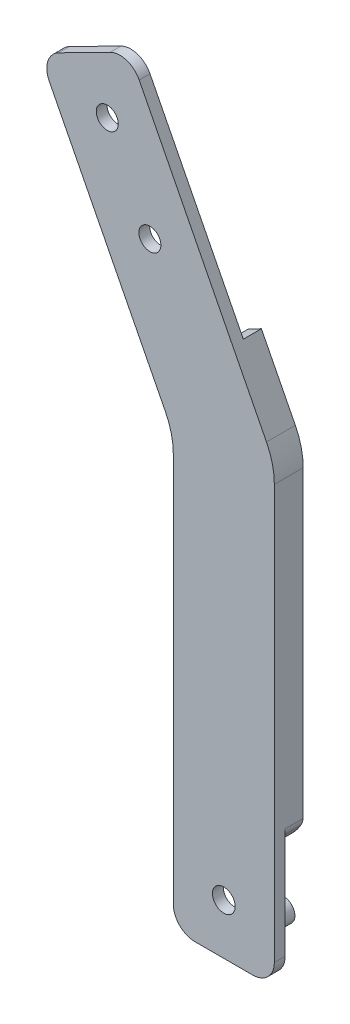
ISO-10303-21;
HEADER;
FILE_DESCRIPTION(('STEP AP214'),'2;1');
FILE_NAME('part.step','',(''),(''),'','','');
FILE_SCHEMA(('AUTOMOTIVE_DESIGN { 1 0 10303 214 1 1 1 1 }'));
ENDSEC;
DATA;
#1=APPLICATION_CONTEXT('core data for automotive mechanical design processes');
#2=APPLICATION_PROTOCOL_DEFINITION('international standard','automotive_design',2000,#1);
#3=PRODUCT_CONTEXT('',#1,'mechanical');
#4=PRODUCT('Part','Part','',(#3));
#5=PRODUCT_RELATED_PRODUCT_CATEGORY('part','',(#4));
#6=PRODUCT_DEFINITION_FORMATION('','',#4);
#7=PRODUCT_DEFINITION_CONTEXT('part definition',#1,'design');
#8=PRODUCT_DEFINITION('design','',#6,#7);
#9=PRODUCT_DEFINITION_SHAPE('','',#8);
#10=(LENGTH_UNIT() NAMED_UNIT(*) SI_UNIT(.MILLI.,.METRE.));
#11=(NAMED_UNIT(*) PLANE_ANGLE_UNIT() SI_UNIT($,.RADIAN.));
#12=(NAMED_UNIT(*) SI_UNIT($,.STERADIAN.) SOLID_ANGLE_UNIT());
#13=UNCERTAINTY_MEASURE_WITH_UNIT(LENGTH_MEASURE(1.E-05),#10,'distance_accuracy_value','');
#14=(GEOMETRIC_REPRESENTATION_CONTEXT(3) GLOBAL_UNCERTAINTY_ASSIGNED_CONTEXT((#13)) GLOBAL_UNIT_ASSIGNED_CONTEXT((#10,
#11,#12)) REPRESENTATION_CONTEXT('',''));
#15=CARTESIAN_POINT('',(0.,0.,0.));
#16=DIRECTION('',(0.,0.,1.));
#17=DIRECTION('',(1.,0.,0.));
#18=AXIS2_PLACEMENT_3D('',#15,#16,#17);
#19=CARTESIAN_POINT('',(0.,0.,0.));
#20=DIRECTION('',(0.,0.,1.));
#21=DIRECTION('',(1.,0.,0.));
#22=AXIS2_PLACEMENT_3D('',#19,#20,#21);
#23=PLANE('',#22);
#24=CARTESIAN_POINT('',(7.59061625738334,126.665302464628,0.));
#25=DIRECTION('',(0.,0.,1.));
#26=DIRECTION('',(1.,0.,0.));
#27=AXIS2_PLACEMENT_3D('',#24,#25,#26);
#28=CIRCLE('',#27,1.52499999999986);
#29=CARTESIAN_POINT('',(9.1156162573832,126.665302464628,0.));
#30=VERTEX_POINT('',#29);
#31=EDGE_CURVE('E254',#30,#30,#28,.T.);
#32=ORIENTED_EDGE('',*,*,#31,.T.);
#33=EDGE_LOOP('',(#32));
#34=FACE_BOUND('',#33,.T.);
#35=CARTESIAN_POINT('',(1.68873976076937,138.248387279077,0.));
#36=DIRECTION('',(0.,0.,1.));
#37=DIRECTION('',(1.,0.,0.));
#38=AXIS2_PLACEMENT_3D('',#35,#36,#37);
#39=CIRCLE('',#38,1.52499999999995);
#40=CARTESIAN_POINT('',(3.21373976076932,138.248387279077,0.));
#41=VERTEX_POINT('',#40);
#42=EDGE_CURVE('E260',#41,#41,#39,.T.);
#43=ORIENTED_EDGE('',*,*,#42,.T.);
#44=EDGE_LOOP('',(#43));
#45=FACE_BOUND('',#44,.T.);
#46=DIRECTION('',(0.891006524188374,0.453990499739535,0.));
#47=VECTOR('',#46,1.);
#48=CARTESIAN_POINT('',(-44.458697896471,87.2551075526966,0.));
#49=LINE('',#48,#47);
#50=CARTESIAN_POINT('',(6.5675818546153,113.254295678896,0.));
#51=VERTEX_POINT('',#50);
#52=CARTESIAN_POINT('',(8.34959490299204,114.162276678376,0.));
#53=VERTEX_POINT('',#52);
#54=EDGE_CURVE('E373',#51,#53,#49,.T.);
#55=ORIENTED_EDGE('',*,*,#54,.F.);
#56=DIRECTION('',(0.453990499739536,-0.891006524188373,0.));
#57=VECTOR('',#56,1.);
#58=CARTESIAN_POINT('',(-7.72623940672607,141.307499450219,0.));
#59=LINE('',#58,#57);
#60=CARTESIAN_POINT('',(-6.36426790750746,138.634479877654,0.));
#61=VERTEX_POINT('',#60);
#62=EDGE_CURVE('E305',#61,#51,#59,.T.);
#63=ORIENTED_EDGE('',*,*,#62,.F.);
#64=CARTESIAN_POINT('',(-3.69124833494234,139.996451376872,0.));
#65=DIRECTION('',(0.,0.,1.));
#66=DIRECTION('',(1.,0.,0.));
#67=AXIS2_PLACEMENT_3D('',#64,#65,#66);
#68=CIRCLE('',#67,3.);
#69=CARTESIAN_POINT('',(-5.05321983416097,142.669470949437,0.));
#70=VERTEX_POINT('',#69);
#71=EDGE_CURVE('E324',#61,#70,#68,.F.);
#72=ORIENTED_EDGE('',*,*,#71,.T.);
#73=DIRECTION('',(-0.891006524188373,-0.453990499739537,0.));
#74=VECTOR('',#73,1.);
#75=CARTESIAN_POINT('',(-7.72623940672607,141.307499450219,0.));
#76=LINE('',#75,#74);
#77=CARTESIAN_POINT('',(2.07483235934615,146.301394947354,0.));
#78=VERTEX_POINT('',#77);
#79=EDGE_CURVE('E302',#78,#70,#76,.T.);
#80=ORIENTED_EDGE('',*,*,#79,.F.);
#81=CARTESIAN_POINT('',(3.43680385856476,143.628375374789,0.));
#82=DIRECTION('',(0.,0.,1.));
#83=DIRECTION('',(1.,0.,0.));
#84=AXIS2_PLACEMENT_3D('',#81,#82,#83);
#85=CIRCLE('',#84,3.);
#86=CARTESIAN_POINT('',(6.10982343112988,144.990346874007,0.));
#87=VERTEX_POINT('',#86);
#88=EDGE_CURVE('E321',#78,#87,#85,.F.);
#89=ORIENTED_EDGE('',*,*,#88,.T.);
#90=DIRECTION('',(-0.453990499739536,0.891006524188373,0.));
#91=VECTOR('',#90,1.);
#92=CARTESIAN_POINT('',(4.74785193191127,147.663366446572,0.));
#93=LINE('',#92,#91);
#94=CARTESIAN_POINT('',(19.0416731932526,119.61016267525,0.));
#95=VERTEX_POINT('',#94);
#96=EDGE_CURVE('E300',#95,#87,#93,.T.);
#97=ORIENTED_EDGE('',*,*,#96,.F.);
#98=DIRECTION('',(0.89100652418837,0.453990499739543,0.));
#99=VECTOR('',#98,1.);
#100=CARTESIAN_POINT('',(-44.4586978964715,87.2551075526956,0.));
#101=LINE('',#100,#99);
#102=CARTESIAN_POINT('',(17.2596601448759,118.702181675771,0.));
#103=VERTEX_POINT('',#102);
#104=EDGE_CURVE('E399',#103,#95,#101,.T.);
#105=ORIENTED_EDGE('',*,*,#104,.F.);
#106=DIRECTION('',(-0.453990499739536,0.891006524188373,0.));
#107=VECTOR('',#106,1.);
#108=CARTESIAN_POINT('',(61.718358041347,31.4470741230745,0.));
#109=LINE('',#108,#107);
#110=CARTESIAN_POINT('',(21.9635023044154,109.47037163722,0.));
#111=VERTEX_POINT('',#110);
#112=EDGE_CURVE('E396',#111,#103,#109,.T.);
#113=ORIENTED_EDGE('',*,*,#112,.F.);
#114=CARTESIAN_POINT('',(14.8354501109084,105.838447639304,0.));
#115=DIRECTION('',(0.,0.,-1.));
#116=DIRECTION('',(-1.,0.,0.));
#117=AXIS2_PLACEMENT_3D('',#114,#115,#116);
#118=CIRCLE('',#117,8.);
#119=CARTESIAN_POINT('',(22.8354501109084,105.838447639304,0.));
#120=VERTEX_POINT('',#119);
#121=EDGE_CURVE('E394',#111,#120,#118,.T.);
#122=ORIENTED_EDGE('',*,*,#121,.T.);
#123=DIRECTION('',(0.,1.,0.));
#124=VECTOR('',#123,1.);
#125=CARTESIAN_POINT('',(22.8354501109084,0.,0.));
#126=LINE('',#125,#124);
#127=CARTESIAN_POINT('',(22.8354501109084,69.217112450621,0.));
#128=VERTEX_POINT('',#127);
#129=EDGE_CURVE('E391',#128,#120,#126,.T.);
#130=ORIENTED_EDGE('',*,*,#129,.F.);
#131=DIRECTION('',(-1.,0.,0.));
#132=VECTOR('',#131,1.);
#133=CARTESIAN_POINT('',(0.,69.217112450621,0.));
#134=LINE('',#133,#132);
#135=CARTESIAN_POINT('',(12.8354501109083,69.217112450621,0.));
#136=VERTEX_POINT('',#135);
#137=EDGE_CURVE('E389',#128,#136,#134,.T.);
#138=ORIENTED_EDGE('',*,*,#137,.T.);
#139=DIRECTION('',(0.,-1.,0.));
#140=VECTOR('',#139,1.);
#141=CARTESIAN_POINT('',(12.8354501109083,0.,0.));
#142=LINE('',#141,#140);
#143=CARTESIAN_POINT('',(12.8354501109083,102.477345012182,0.));
#144=VERTEX_POINT('',#143);
#145=EDGE_CURVE('E386',#144,#136,#142,.T.);
#146=ORIENTED_EDGE('',*,*,#145,.F.);
#147=CARTESIAN_POINT('',(0.835450110908313,102.477345012182,0.));
#148=DIRECTION('',(0.,0.,-1.));
#149=DIRECTION('',(-1.,0.,0.));
#150=AXIS2_PLACEMENT_3D('',#147,#148,#149);
#151=CIRCLE('',#150,12.);
#152=CARTESIAN_POINT('',(11.5275284011688,107.925231009057,0.));
#153=VERTEX_POINT('',#152);
#154=EDGE_CURVE('E57',#153,#144,#151,.T.);
#155=ORIENTED_EDGE('',*,*,#154,.F.);
#156=DIRECTION('',(0.453990499739535,-0.891006524188374,0.));
#157=VECTOR('',#156,1.);
#158=CARTESIAN_POINT('',(52.8082927994631,26.907169125679,0.));
#159=LINE('',#158,#157);
#160=EDGE_CURVE('E52',#53,#153,#159,.T.);
#161=ORIENTED_EDGE('',*,*,#160,.F.);
#162=EDGE_LOOP('',(#55,#63,#72,#80,#89,#97,#105,#113,#122,#130,#138,#146,#155,#161));
#163=FACE_BOUND('',#162,.T.);
#164=ADVANCED_FACE('F37',(#34,#45,#163),#23,.F.);
#165=CARTESIAN_POINT('',(17.8354501109085,52.4568448718525,0.));
#166=DIRECTION('',(0.,0.,1.));
#167=DIRECTION('',(1.,0.,0.));
#168=AXIS2_PLACEMENT_3D('',#165,#166,#167);
#169=CIRCLE('',#168,1.575);
#170=CARTESIAN_POINT('',(19.4104501109085,52.4568448718525,0.));
#171=VERTEX_POINT('',#170);
#172=EDGE_CURVE('E266',#171,#171,#169,.T.);
#173=ORIENTED_EDGE('',*,*,#172,.T.);
#174=EDGE_LOOP('',(#173));
#175=FACE_BOUND('',#174,.T.);
#176=CARTESIAN_POINT('',(13.5321406262647,53.4210167856623,0.));
#177=DIRECTION('',(0.,0.,1.));
#178=DIRECTION('',(1.,0.,0.));
#179=AXIS2_PLACEMENT_3D('',#176,#177,#178);
#180=CIRCLE('',#179,1.55);
#181=CARTESIAN_POINT('',(15.0821406262647,53.4210167856623,0.));
#182=VERTEX_POINT('',#181);
#183=EDGE_CURVE('E249',#182,#182,#180,.T.);
#184=ORIENTED_EDGE('',*,*,#183,.T.);
#185=EDGE_LOOP('',(#184));
#186=FACE_BOUND('',#185,.T.);
#187=CARTESIAN_POINT('',(22.138759595552,51.4926729580468,0.));
#188=DIRECTION('',(0.,0.,1.));
#189=DIRECTION('',(1.,0.,0.));
#190=AXIS2_PLACEMENT_3D('',#187,#188,#189);
#191=CIRCLE('',#190,1.55);
#192=CARTESIAN_POINT('',(23.688759595552,51.4926729580468,0.));
#193=VERTEX_POINT('',#192);
#194=EDGE_CURVE('E239',#193,#193,#191,.T.);
#195=ORIENTED_EDGE('',*,*,#194,.T.);
#196=EDGE_LOOP('',(#195));
#197=FACE_BOUND('',#196,.T.);
#198=CARTESIAN_POINT('',(14.402001202624,59.217112450621,0.));
#199=CARTESIAN_POINT('',(12.7412601634665,59.1385823644695,0.));
#200=CARTESIAN_POINT('',(8.32344941305151,57.7615216555273,0.));
#201=CARTESIAN_POINT('',(8.76047999314383,53.1041844823531,0.));
#202=CARTESIAN_POINT('',(9.53918293554433,51.6023980939936,0.));
#203=B_SPLINE_CURVE_WITH_KNOTS('',3,(#198,#199,#200,#201,#202),.UNSPECIFIED.,.F.,.F.,(4,1,4),
(0.,0.49949207509832,1.),.UNSPECIFIED.);
#204=CARTESIAN_POINT('',(14.402001202624,59.217112450621,0.));
#205=VERTEX_POINT('',#204);
#206=CARTESIAN_POINT('',(10.8354501109083,58.1623408521857,0.));
#207=VERTEX_POINT('',#206);
#208=EDGE_CURVE('E377',#205,#207,#203,.T.);
#209=ORIENTED_EDGE('',*,*,#208,.F.);
#210=DIRECTION('',(-1.,0.,0.));
#211=VECTOR('',#210,1.);
#212=CARTESIAN_POINT('',(0.,59.217112450621,0.));
#213=LINE('',#212,#211);
#214=CARTESIAN_POINT('',(19.3200544040474,59.217112450621,0.));
#215=VERTEX_POINT('',#214);
#216=EDGE_CURVE('E238',#215,#205,#213,.T.);
#217=ORIENTED_EDGE('',*,*,#216,.F.);
#218=CARTESIAN_POINT('',(18.2020790663273,66.3953060813018,0.));
#219=DIRECTION('',(0.,0.,-1.));
#220=DIRECTION('',(-1.,0.,0.));
#221=AXIS2_PLACEMENT_3D('',#218,#219,#220);
#222=CIRCLE('',#221,7.26473211173666);
#223=CARTESIAN_POINT('',(24.4885661284127,62.7543703398294,0.));
#224=VERTEX_POINT('',#223);
#225=EDGE_CURVE('E235',#224,#215,#222,.T.);
#226=ORIENTED_EDGE('',*,*,#225,.F.);
#227=CARTESIAN_POINT('',(22.1030296407012,64.1359981034622,0.));
#228=DIRECTION('',(0.,0.,-1.));
#229=DIRECTION('',(-1.,0.,0.));
#230=AXIS2_PLACEMENT_3D('',#227,#228,#229);
#231=CIRCLE('',#230,2.7567516412335);
#232=CARTESIAN_POINT('',(24.8354501109084,63.7705422436978,0.));
#233=VERTEX_POINT('',#232);
#234=EDGE_CURVE('E402',#233,#224,#231,.T.);
#235=ORIENTED_EDGE('',*,*,#234,.F.);
#236=DIRECTION('',(0.,1.,0.));
#237=VECTOR('',#236,1.);
#238=CARTESIAN_POINT('',(24.8354501109084,45.4568448718528,0.));
#239=LINE('',#238,#237);
#240=CARTESIAN_POINT('',(24.8354501109084,48.4568448718527,0.));
#241=VERTEX_POINT('',#240);
#242=EDGE_CURVE('E297',#241,#233,#239,.T.);
#243=ORIENTED_EDGE('',*,*,#242,.F.);
#244=CARTESIAN_POINT('',(21.8354501109084,48.4568448718527,0.));
#245=DIRECTION('',(0.,0.,1.));
#246=DIRECTION('',(1.,0.,0.));
#247=AXIS2_PLACEMENT_3D('',#244,#245,#246);
#248=CIRCLE('',#247,3.);
#249=CARTESIAN_POINT('',(21.8354501109085,45.4568448718527,0.));
#250=VERTEX_POINT('',#249);
#251=EDGE_CURVE('E329',#241,#250,#248,.F.);
#252=ORIENTED_EDGE('',*,*,#251,.T.);
#253=DIRECTION('',(1.,0.,0.));
#254=VECTOR('',#253,1.);
#255=CARTESIAN_POINT('',(10.8354501109083,45.4568448718525,0.));
#256=LINE('',#255,#254);
#257=CARTESIAN_POINT('',(13.8354501109084,45.4568448718526,0.));
#258=VERTEX_POINT('',#257);
#259=EDGE_CURVE('E272',#258,#250,#256,.T.);
#260=ORIENTED_EDGE('',*,*,#259,.F.);
#261=CARTESIAN_POINT('',(13.8354501109083,48.4568448718526,0.));
#262=DIRECTION('',(0.,0.,1.));
#263=DIRECTION('',(1.,0.,0.));
#264=AXIS2_PLACEMENT_3D('',#261,#262,#263);
#265=CIRCLE('',#264,3.);
#266=CARTESIAN_POINT('',(10.8354501109083,48.4568448718526,0.));
#267=VERTEX_POINT('',#266);
#268=EDGE_CURVE('E326',#258,#267,#265,.F.);
#269=ORIENTED_EDGE('',*,*,#268,.T.);
#270=DIRECTION('',(0.,-1.,0.));
#271=VECTOR('',#270,1.);
#272=CARTESIAN_POINT('',(10.8354501109083,45.4568448718525,0.));
#273=LINE('',#272,#271);
#274=EDGE_CURVE('E279',#207,#267,#273,.T.);
#275=ORIENTED_EDGE('',*,*,#274,.F.);
#276=EDGE_LOOP('',(#209,#217,#226,#235,#243,#252,#260,#269,#275));
#277=FACE_BOUND('',#276,.T.);
#278=ADVANCED_FACE('F489',(#175,#186,#197,#277),#23,.F.);
#279=CARTESIAN_POINT('',(0.,0.,1.5));
#280=DIRECTION('',(0.,0.,1.));
#281=DIRECTION('',(1.,0.,0.));
#282=AXIS2_PLACEMENT_3D('',#279,#280,#281);
#283=PLANE('',#282);
#284=CARTESIAN_POINT('',(1.68873976076937,138.248387279077,1.5));
#285=DIRECTION('',(0.,0.,1.));
#286=DIRECTION('',(1.,0.,0.));
#287=AXIS2_PLACEMENT_3D('',#284,#285,#286);
#288=CIRCLE('',#287,1.52499999999995);
#289=CARTESIAN_POINT('',(3.21373976076932,138.248387279077,1.5));
#290=VERTEX_POINT('',#289);
#291=EDGE_CURVE('E263',#290,#290,#288,.T.);
#292=ORIENTED_EDGE('',*,*,#291,.F.);
#293=EDGE_LOOP('',(#292));
#294=FACE_BOUND('',#293,.T.);
#295=DIRECTION('',(0.,1.,0.));
#296=VECTOR('',#295,1.);
#297=CARTESIAN_POINT('',(24.8354501109084,45.4568448718528,1.5));
#298=LINE('',#297,#296);
#299=CARTESIAN_POINT('',(24.8354501109084,48.4568448718527,1.5));
#300=VERTEX_POINT('',#299);
#301=CARTESIAN_POINT('',(24.8354501109084,105.838447639304,1.5));
#302=VERTEX_POINT('',#301);
#303=EDGE_CURVE('E278',#300,#302,#298,.T.);
#304=ORIENTED_EDGE('',*,*,#303,.T.);
#305=CARTESIAN_POINT('',(14.8354501109084,105.838447639304,1.5));
#306=DIRECTION('',(0.,0.,1.));
#307=DIRECTION('',(1.,0.,0.));
#308=AXIS2_PLACEMENT_3D('',#305,#306,#307);
#309=CIRCLE('',#308,10.);
#310=CARTESIAN_POINT('',(23.7455153527922,110.378352636699,1.5));
#311=VERTEX_POINT('',#310);
#312=EDGE_CURVE('E344',#302,#311,#309,.T.);
#313=ORIENTED_EDGE('',*,*,#312,.T.);
#314=DIRECTION('',(-0.453990499739536,0.891006524188373,0.));
#315=VECTOR('',#314,1.);
#316=CARTESIAN_POINT('',(4.74785193191127,147.663366446572,1.5));
#317=LINE('',#316,#315);
#318=CARTESIAN_POINT('',(6.10982343112988,144.990346874007,1.5));
#319=VERTEX_POINT('',#318);
#320=EDGE_CURVE('E282',#311,#319,#317,.T.);
#321=ORIENTED_EDGE('',*,*,#320,.T.);
#322=CARTESIAN_POINT('',(3.43680385856476,143.628375374789,1.5));
#323=DIRECTION('',(0.,0.,1.));
#324=DIRECTION('',(1.,0.,0.));
#325=AXIS2_PLACEMENT_3D('',#322,#323,#324);
#326=CIRCLE('',#325,3.);
#327=CARTESIAN_POINT('',(2.07483235934615,146.301394947354,1.5));
#328=VERTEX_POINT('',#327);
#329=EDGE_CURVE('E336',#319,#328,#326,.T.);
#330=ORIENTED_EDGE('',*,*,#329,.T.);
#331=DIRECTION('',(-0.891006524188373,-0.453990499739537,0.));
#332=VECTOR('',#331,1.);
#333=CARTESIAN_POINT('',(-7.72623940672607,141.307499450219,1.5));
#334=LINE('',#333,#332);
#335=CARTESIAN_POINT('',(-5.05321983416097,142.669470949437,1.5));
#336=VERTEX_POINT('',#335);
#337=EDGE_CURVE('E285',#328,#336,#334,.T.);
#338=ORIENTED_EDGE('',*,*,#337,.T.);
#339=CARTESIAN_POINT('',(-3.69124833494234,139.996451376872,1.5));
#340=DIRECTION('',(0.,0.,1.));
#341=DIRECTION('',(1.,0.,0.));
#342=AXIS2_PLACEMENT_3D('',#339,#340,#341);
#343=CIRCLE('',#342,3.);
#344=CARTESIAN_POINT('',(-6.36426790750746,138.634479877654,1.5));
#345=VERTEX_POINT('',#344);
#346=EDGE_CURVE('E338',#336,#345,#343,.T.);
#347=ORIENTED_EDGE('',*,*,#346,.T.);
#348=DIRECTION('',(0.453990499739536,-0.891006524188373,0.));
#349=VECTOR('',#348,1.);
#350=CARTESIAN_POINT('',(-7.72623940672607,141.307499450219,1.5));
#351=LINE('',#350,#349);
#352=CARTESIAN_POINT('',(9.74551535279205,107.017250009578,1.5));
#353=VERTEX_POINT('',#352);
#354=EDGE_CURVE('E288',#345,#353,#351,.T.);
#355=ORIENTED_EDGE('',*,*,#354,.T.);
#356=CARTESIAN_POINT('',(0.835450110908313,102.477345012182,1.5));
#357=DIRECTION('',(0.,0.,1.));
#358=DIRECTION('',(1.,0.,0.));
#359=AXIS2_PLACEMENT_3D('',#356,#357,#358);
#360=CIRCLE('',#359,10.);
#361=CARTESIAN_POINT('',(10.8354501109083,102.477345012182,1.5));
#362=VERTEX_POINT('',#361);
#363=EDGE_CURVE('E12',#353,#362,#360,.F.);
#364=ORIENTED_EDGE('',*,*,#363,.T.);
#365=DIRECTION('',(0.,-1.,0.));
#366=VECTOR('',#365,1.);
#367=CARTESIAN_POINT('',(10.8354501109083,45.4568448718525,1.5));
#368=LINE('',#367,#366);
#369=CARTESIAN_POINT('',(10.8354501109083,48.4568448718526,1.5));
#370=VERTEX_POINT('',#369);
#371=EDGE_CURVE('E291',#362,#370,#368,.T.);
#372=ORIENTED_EDGE('',*,*,#371,.T.);
#373=CARTESIAN_POINT('',(13.8354501109083,48.4568448718526,1.5));
#374=DIRECTION('',(0.,0.,1.));
#375=DIRECTION('',(1.,0.,0.));
#376=AXIS2_PLACEMENT_3D('',#373,#374,#375);
#377=CIRCLE('',#376,3.);
#378=CARTESIAN_POINT('',(13.8354501109084,45.4568448718526,1.5));
#379=VERTEX_POINT('',#378);
#380=EDGE_CURVE('E340',#370,#379,#377,.T.);
#381=ORIENTED_EDGE('',*,*,#380,.T.);
#382=DIRECTION('',(1.,0.,0.));
#383=VECTOR('',#382,1.);
#384=CARTESIAN_POINT('',(10.8354501109083,45.4568448718525,1.5));
#385=LINE('',#384,#383);
#386=CARTESIAN_POINT('',(21.8354501109085,45.4568448718527,1.5));
#387=VERTEX_POINT('',#386);
#388=EDGE_CURVE('E275',#379,#387,#385,.T.);
#389=ORIENTED_EDGE('',*,*,#388,.T.);
#390=CARTESIAN_POINT('',(21.8354501109084,48.4568448718527,1.5));
#391=DIRECTION('',(0.,0.,1.));
#392=DIRECTION('',(1.,0.,0.));
#393=AXIS2_PLACEMENT_3D('',#390,#391,#392);
#394=CIRCLE('',#393,3.);
#395=EDGE_CURVE('E342',#387,#300,#394,.T.);
#396=ORIENTED_EDGE('',*,*,#395,.T.);
#397=EDGE_LOOP('',(#304,#313,#321,#330,#338,#347,#355,#364,#372,#381,#389,#396));
#398=FACE_BOUND('',#397,.T.);
#399=CARTESIAN_POINT('',(17.8354501109085,52.4568448718525,1.5));
#400=DIRECTION('',(0.,0.,1.));
#401=DIRECTION('',(1.,0.,0.));
#402=AXIS2_PLACEMENT_3D('',#399,#400,#401);
#403=CIRCLE('',#402,1.575);
#404=CARTESIAN_POINT('',(19.4104501109085,52.4568448718525,1.5));
#405=VERTEX_POINT('',#404);
#406=EDGE_CURVE('E269',#405,#405,#403,.T.);
#407=ORIENTED_EDGE('',*,*,#406,.F.);
#408=EDGE_LOOP('',(#407));
#409=FACE_BOUND('',#408,.T.);
#410=CARTESIAN_POINT('',(7.59061625738334,126.665302464628,1.5));
#411=DIRECTION('',(0.,0.,1.));
#412=DIRECTION('',(1.,0.,0.));
#413=AXIS2_PLACEMENT_3D('',#410,#411,#412);
#414=CIRCLE('',#413,1.52499999999986);
#415=CARTESIAN_POINT('',(9.1156162573832,126.665302464628,1.5));
#416=VERTEX_POINT('',#415);
#417=EDGE_CURVE('E257',#416,#416,#414,.T.);
#418=ORIENTED_EDGE('',*,*,#417,.F.);
#419=EDGE_LOOP('',(#418));
#420=FACE_BOUND('',#419,.T.);
#421=ADVANCED_FACE('F362',(#294,#398,#409,#420),#283,.T.);
#422=CARTESIAN_POINT('',(10.8354501109083,45.4568448718525,1.5));
#423=DIRECTION('',(0.,1.,0.));
#424=DIRECTION('',(-1.,0.,0.));
#425=AXIS2_PLACEMENT_3D('',#422,#423,#424);
#426=PLANE('',#425);
#427=ORIENTED_EDGE('',*,*,#259,.T.);
#428=DIRECTION('',(0.,0.,-1.));
#429=VECTOR('',#428,1.);
#430=CARTESIAN_POINT('',(21.8354501109085,45.4568448718527,1.5));
#431=LINE('',#430,#429);
#432=EDGE_CURVE('E349',#250,#387,#431,.F.);
#433=ORIENTED_EDGE('',*,*,#432,.T.);
#434=ORIENTED_EDGE('',*,*,#388,.F.);
#435=DIRECTION('',(0.,0.,-1.));
#436=VECTOR('',#435,1.);
#437=CARTESIAN_POINT('',(13.8354501109084,45.4568448718526,1.5));
#438=LINE('',#437,#436);
#439=EDGE_CURVE('E346',#379,#258,#438,.T.);
#440=ORIENTED_EDGE('',*,*,#439,.T.);
#441=EDGE_LOOP('',(#427,#433,#434,#440));
#442=FACE_BOUND('',#441,.T.);
#443=ADVANCED_FACE('F540',(#442),#426,.F.);
#444=CARTESIAN_POINT('',(24.8354501109084,45.4568448718528,1.5));
#445=DIRECTION('',(-1.,0.,0.));
#446=DIRECTION('',(0.,-1.,0.));
#447=AXIS2_PLACEMENT_3D('',#444,#445,#446);
#448=PLANE('',#447);
#449=ORIENTED_EDGE('',*,*,#242,.T.);
#450=DIRECTION('',(0.,0.,1.));
#451=VECTOR('',#450,1.);
#452=CARTESIAN_POINT('',(24.8354501109084,63.7705422436978,-2.5));
#453=LINE('',#452,#451);
#454=CARTESIAN_POINT('',(24.8354501109084,63.7705422436978,-2.5));
#455=VERTEX_POINT('',#454);
#456=EDGE_CURVE('E412',#455,#233,#453,.T.);
#457=ORIENTED_EDGE('',*,*,#456,.F.);
#458=DIRECTION('',(0.,-1.,0.));
#459=VECTOR('',#458,1.);
#460=CARTESIAN_POINT('',(24.8354501109084,0.,-2.5));
#461=LINE('',#460,#459);
#462=CARTESIAN_POINT('',(24.8354501109084,105.838447639304,-2.5));
#463=VERTEX_POINT('',#462);
#464=EDGE_CURVE('E476',#463,#455,#461,.T.);
#465=ORIENTED_EDGE('',*,*,#464,.F.);
#466=DIRECTION('',(0.,0.,-1.));
#467=VECTOR('',#466,1.);
#468=CARTESIAN_POINT('',(24.8354501109084,105.838447639304,1.5));
#469=LINE('',#468,#467);
#470=EDGE_CURVE('E334',#463,#302,#469,.F.);
#471=ORIENTED_EDGE('',*,*,#470,.T.);
#472=ORIENTED_EDGE('',*,*,#303,.F.);
#473=DIRECTION('',(0.,0.,-1.));
#474=VECTOR('',#473,1.);
#475=CARTESIAN_POINT('',(24.8354501109084,48.4568448718527,1.5));
#476=LINE('',#475,#474);
#477=EDGE_CURVE('E331',#300,#241,#476,.T.);
#478=ORIENTED_EDGE('',*,*,#477,.T.);
#479=EDGE_LOOP('',(#449,#457,#465,#471,#472,#478));
#480=FACE_BOUND('',#479,.T.);
#481=ADVANCED_FACE('F554',(#480),#448,.F.);
#482=CARTESIAN_POINT('',(4.74785193191127,147.663366446572,1.5));
#483=DIRECTION('',(-0.891006524188373,-0.453990499739536,0.));
#484=DIRECTION('',(0.453990499739536,-0.891006524188373,0.));
#485=AXIS2_PLACEMENT_3D('',#482,#483,#484);
#486=PLANE('',#485);
#487=ORIENTED_EDGE('',*,*,#320,.F.);
#488=DIRECTION('',(0.,0.,-1.));
#489=VECTOR('',#488,1.);
#490=CARTESIAN_POINT('',(23.7455153527922,110.378352636699,1.5));
#491=LINE('',#490,#489);
#492=CARTESIAN_POINT('',(23.7455153527922,110.378352636699,-2.5));
#493=VERTEX_POINT('',#492);
#494=EDGE_CURVE('E319',#311,#493,#491,.T.);
#495=ORIENTED_EDGE('',*,*,#494,.T.);
#496=DIRECTION('',(0.453990499739536,-0.891006524188373,0.));
#497=VECTOR('',#496,1.);
#498=CARTESIAN_POINT('',(63.5003710897237,32.3550551225535,-2.5));
#499=LINE('',#498,#497);
#500=CARTESIAN_POINT('',(19.0416731932526,119.61016267525,-2.5));
#501=VERTEX_POINT('',#500);
#502=EDGE_CURVE('E470',#501,#493,#499,.T.);
#503=ORIENTED_EDGE('',*,*,#502,.F.);
#504=DIRECTION('',(0.,0.,1.));
#505=VECTOR('',#504,1.);
#506=CARTESIAN_POINT('',(19.0416731932526,119.61016267525,-2.5));
#507=LINE('',#506,#505);
#508=EDGE_CURVE('E415',#501,#95,#507,.T.);
#509=ORIENTED_EDGE('',*,*,#508,.T.);
#510=ORIENTED_EDGE('',*,*,#96,.T.);
#511=DIRECTION('',(0.,0.,-1.));
#512=VECTOR('',#511,1.);
#513=CARTESIAN_POINT('',(6.10982343112988,144.990346874007,1.5));
#514=LINE('',#513,#512);
#515=EDGE_CURVE('E317',#87,#319,#514,.F.);
#516=ORIENTED_EDGE('',*,*,#515,.T.);
#517=EDGE_LOOP('',(#487,#495,#503,#509,#510,#516));
#518=FACE_BOUND('',#517,.T.);
#519=ADVANCED_FACE('F551',(#518),#486,.F.);
#520=CARTESIAN_POINT('',(-7.72623940672607,141.307499450219,1.5));
#521=DIRECTION('',(0.453990499739537,-0.891006524188373,0.));
#522=DIRECTION('',(0.891006524188373,0.453990499739537,0.));
#523=AXIS2_PLACEMENT_3D('',#520,#521,#522);
#524=PLANE('',#523);
#525=ORIENTED_EDGE('',*,*,#79,.T.);
#526=DIRECTION('',(0.,0.,-1.));
#527=VECTOR('',#526,1.);
#528=CARTESIAN_POINT('',(-5.05321983416097,142.669470949437,1.5));
#529=LINE('',#528,#527);
#530=EDGE_CURVE('E45',#70,#336,#529,.F.);
#531=ORIENTED_EDGE('',*,*,#530,.T.);
#532=ORIENTED_EDGE('',*,*,#337,.F.);
#533=DIRECTION('',(0.,0.,-1.));
#534=VECTOR('',#533,1.);
#535=CARTESIAN_POINT('',(2.07483235934615,146.301394947354,1.5));
#536=LINE('',#535,#534);
#537=EDGE_CURVE('E351',#328,#78,#536,.T.);
#538=ORIENTED_EDGE('',*,*,#537,.T.);
#539=EDGE_LOOP('',(#525,#531,#532,#538));
#540=FACE_BOUND('',#539,.T.);
#541=ADVANCED_FACE('F356',(#540),#524,.F.);
#542=CARTESIAN_POINT('',(-7.72623940672607,141.307499450219,1.5));
#543=DIRECTION('',(0.891006524188373,0.453990499739536,0.));
#544=DIRECTION('',(-0.453990499739536,0.891006524188373,0.));
#545=AXIS2_PLACEMENT_3D('',#542,#543,#544);
#546=PLANE('',#545);
#547=ORIENTED_EDGE('',*,*,#62,.T.);
#548=DIRECTION('',(0.,0.,1.));
#549=VECTOR('',#548,1.);
#550=CARTESIAN_POINT('',(6.5675818546153,113.254295678896,-2.5));
#551=LINE('',#550,#549);
#552=CARTESIAN_POINT('',(6.5675818546153,113.254295678896,-2.5));
#553=VERTEX_POINT('',#552);
#554=EDGE_CURVE('E244',#553,#51,#551,.T.);
#555=ORIENTED_EDGE('',*,*,#554,.F.);
#556=DIRECTION('',(-0.453990499739536,0.891006524188373,0.));
#557=VECTOR('',#556,1.);
#558=CARTESIAN_POINT('',(51.0262797510864,25.9991881262,-2.5));
#559=LINE('',#558,#557);
#560=CARTESIAN_POINT('',(9.74551535279207,107.017250009578,-2.5));
#561=VERTEX_POINT('',#560);
#562=EDGE_CURVE('E444',#561,#553,#559,.T.);
#563=ORIENTED_EDGE('',*,*,#562,.F.);
#564=DIRECTION('',(0.,0.,-1.));
#565=VECTOR('',#564,1.);
#566=CARTESIAN_POINT('',(9.74551535279205,107.017250009578,1.5));
#567=LINE('',#566,#565);
#568=EDGE_CURVE('E315',#561,#353,#567,.F.);
#569=ORIENTED_EDGE('',*,*,#568,.T.);
#570=ORIENTED_EDGE('',*,*,#354,.F.);
#571=DIRECTION('',(0.,0.,-1.));
#572=VECTOR('',#571,1.);
#573=CARTESIAN_POINT('',(-6.36426790750746,138.634479877654,1.5));
#574=LINE('',#573,#572);
#575=EDGE_CURVE('E312',#345,#61,#574,.T.);
#576=ORIENTED_EDGE('',*,*,#575,.T.);
#577=EDGE_LOOP('',(#547,#555,#563,#569,#570,#576));
#578=FACE_BOUND('',#577,.T.);
#579=ADVANCED_FACE('F370',(#578),#546,.F.);
#580=CARTESIAN_POINT('',(10.8354501109083,45.4568448718525,1.5));
#581=DIRECTION('',(1.,0.,0.));
#582=DIRECTION('',(0.,1.,0.));
#583=AXIS2_PLACEMENT_3D('',#580,#581,#582);
#584=PLANE('',#583);
#585=ORIENTED_EDGE('',*,*,#371,.F.);
#586=DIRECTION('',(0.,0.,-1.));
#587=VECTOR('',#586,1.);
#588=CARTESIAN_POINT('',(10.8354501109083,102.477345012182,0.));
#589=LINE('',#588,#587);
#590=CARTESIAN_POINT('',(10.8354501109083,102.477345012182,-2.5));
#591=VERTEX_POINT('',#590);
#592=EDGE_CURVE('E310',#362,#591,#589,.T.);
#593=ORIENTED_EDGE('',*,*,#592,.T.);
#594=DIRECTION('',(0.,1.,0.));
#595=VECTOR('',#594,1.);
#596=CARTESIAN_POINT('',(10.8354501109083,0.,-2.5));
#597=LINE('',#596,#595);
#598=CARTESIAN_POINT('',(10.8354501109083,58.1623408521857,-2.5));
#599=VERTEX_POINT('',#598);
#600=EDGE_CURVE('E225',#599,#591,#597,.T.);
#601=ORIENTED_EDGE('',*,*,#600,.F.);
#602=DIRECTION('',(0.,0.,1.));
#603=VECTOR('',#602,1.);
#604=CARTESIAN_POINT('',(10.8354501109083,58.1623408521857,-2.5));
#605=LINE('',#604,#603);
#606=EDGE_CURVE('E221',#599,#207,#605,.T.);
#607=ORIENTED_EDGE('',*,*,#606,.T.);
#608=ORIENTED_EDGE('',*,*,#274,.T.);
#609=DIRECTION('',(0.,0.,-1.));
#610=VECTOR('',#609,1.);
#611=CARTESIAN_POINT('',(10.8354501109083,48.4568448718526,1.5));
#612=LINE('',#611,#610);
#613=EDGE_CURVE('E294',#267,#370,#612,.F.);
#614=ORIENTED_EDGE('',*,*,#613,.T.);
#615=EDGE_LOOP('',(#585,#593,#601,#607,#608,#614));
#616=FACE_BOUND('',#615,.T.);
#617=ADVANCED_FACE('F493',(#616),#584,.F.);
#618=CARTESIAN_POINT('',(17.8354501109085,52.4568448718525,1.5));
#619=DIRECTION('',(0.,0.,-1.));
#620=DIRECTION('',(-1.,0.,0.));
#621=AXIS2_PLACEMENT_3D('',#618,#619,#620);
#622=CYLINDRICAL_SURFACE('',#621,1.575);
#623=ORIENTED_EDGE('',*,*,#406,.T.);
#624=EDGE_LOOP('',(#623));
#625=FACE_BOUND('',#624,.T.);
#626=ORIENTED_EDGE('',*,*,#172,.F.);
#627=EDGE_LOOP('',(#626));
#628=FACE_BOUND('',#627,.T.);
#629=ADVANCED_FACE('F533',(#625,#628),#622,.F.);
#630=CARTESIAN_POINT('',(1.68873976076937,138.248387279077,1.5));
#631=DIRECTION('',(0.,0.,-1.));
#632=DIRECTION('',(-1.,0.,0.));
#633=AXIS2_PLACEMENT_3D('',#630,#631,#632);
#634=CYLINDRICAL_SURFACE('',#633,1.52499999999995);
#635=ORIENTED_EDGE('',*,*,#291,.T.);
#636=EDGE_LOOP('',(#635));
#637=FACE_BOUND('',#636,.T.);
#638=ORIENTED_EDGE('',*,*,#42,.F.);
#639=EDGE_LOOP('',(#638));
#640=FACE_BOUND('',#639,.T.);
#641=ADVANCED_FACE('F529',(#637,#640),#634,.F.);
#642=CARTESIAN_POINT('',(7.59061625738334,126.665302464628,1.5));
#643=DIRECTION('',(0.,0.,-1.));
#644=DIRECTION('',(-1.,0.,0.));
#645=AXIS2_PLACEMENT_3D('',#642,#643,#644);
#646=CYLINDRICAL_SURFACE('',#645,1.52499999999986);
#647=ORIENTED_EDGE('',*,*,#417,.T.);
#648=EDGE_LOOP('',(#647));
#649=FACE_BOUND('',#648,.T.);
#650=ORIENTED_EDGE('',*,*,#31,.F.);
#651=EDGE_LOOP('',(#650));
#652=FACE_BOUND('',#651,.T.);
#653=ADVANCED_FACE('F525',(#649,#652),#646,.F.);
#654=CARTESIAN_POINT('',(0.835450110908313,102.477345012182,1.5));
#655=DIRECTION('',(0.,0.,1.));
#656=DIRECTION('',(1.,0.,0.));
#657=AXIS2_PLACEMENT_3D('',#654,#655,#656);
#658=CYLINDRICAL_SURFACE('',#657,10.);
#659=ORIENTED_EDGE('',*,*,#363,.F.);
#660=ORIENTED_EDGE('',*,*,#568,.F.);
#661=CARTESIAN_POINT('',(0.835450110908313,102.477345012182,-2.5));
#662=DIRECTION('',(0.,0.,-1.));
#663=DIRECTION('',(-1.,0.,0.));
#664=AXIS2_PLACEMENT_3D('',#661,#662,#663);
#665=CIRCLE('',#664,10.);
#666=EDGE_CURVE('E446',#591,#561,#665,.F.);
#667=ORIENTED_EDGE('',*,*,#666,.F.);
#668=ORIENTED_EDGE('',*,*,#592,.F.);
#669=EDGE_LOOP('',(#659,#660,#667,#668));
#670=FACE_BOUND('',#669,.T.);
#671=ADVANCED_FACE('F528',(#670),#658,.F.);
#672=CARTESIAN_POINT('',(14.8354501109084,105.838447639304,1.5));
#673=DIRECTION('',(0.,0.,-1.));
#674=DIRECTION('',(-1.,0.,0.));
#675=AXIS2_PLACEMENT_3D('',#672,#673,#674);
#676=CYLINDRICAL_SURFACE('',#675,10.);
#677=ORIENTED_EDGE('',*,*,#312,.F.);
#678=ORIENTED_EDGE('',*,*,#470,.F.);
#679=CARTESIAN_POINT('',(14.8354501109084,105.838447639304,-2.5));
#680=DIRECTION('',(0.,0.,-1.));
#681=DIRECTION('',(-1.,0.,0.));
#682=AXIS2_PLACEMENT_3D('',#679,#680,#681);
#683=CIRCLE('',#682,10.);
#684=EDGE_CURVE('E473',#493,#463,#683,.T.);
#685=ORIENTED_EDGE('',*,*,#684,.F.);
#686=ORIENTED_EDGE('',*,*,#494,.F.);
#687=EDGE_LOOP('',(#677,#678,#685,#686));
#688=FACE_BOUND('',#687,.T.);
#689=ADVANCED_FACE('F564',(#688),#676,.T.);
#690=CARTESIAN_POINT('',(21.8354501109084,48.4568448718527,1.5));
#691=DIRECTION('',(0.,0.,-1.));
#692=DIRECTION('',(-1.,0.,0.));
#693=AXIS2_PLACEMENT_3D('',#690,#691,#692);
#694=CYLINDRICAL_SURFACE('',#693,3.);
#695=ORIENTED_EDGE('',*,*,#395,.F.);
#696=ORIENTED_EDGE('',*,*,#432,.F.);
#697=ORIENTED_EDGE('',*,*,#251,.F.);
#698=ORIENTED_EDGE('',*,*,#477,.F.);
#699=EDGE_LOOP('',(#695,#696,#697,#698));
#700=FACE_BOUND('',#699,.T.);
#701=ADVANCED_FACE('F568',(#700),#694,.T.);
#702=CARTESIAN_POINT('',(13.8354501109083,48.4568448718526,1.5));
#703=DIRECTION('',(0.,0.,-1.));
#704=DIRECTION('',(-1.,0.,0.));
#705=AXIS2_PLACEMENT_3D('',#702,#703,#704);
#706=CYLINDRICAL_SURFACE('',#705,3.);
#707=ORIENTED_EDGE('',*,*,#380,.F.);
#708=ORIENTED_EDGE('',*,*,#613,.F.);
#709=ORIENTED_EDGE('',*,*,#268,.F.);
#710=ORIENTED_EDGE('',*,*,#439,.F.);
#711=EDGE_LOOP('',(#707,#708,#709,#710));
#712=FACE_BOUND('',#711,.T.);
#713=ADVANCED_FACE('F572',(#712),#706,.T.);
#714=CARTESIAN_POINT('',(-3.69124833494234,139.996451376872,1.5));
#715=DIRECTION('',(0.,0.,-1.));
#716=DIRECTION('',(-1.,0.,0.));
#717=AXIS2_PLACEMENT_3D('',#714,#715,#716);
#718=CYLINDRICAL_SURFACE('',#717,3.);
#719=ORIENTED_EDGE('',*,*,#346,.F.);
#720=ORIENTED_EDGE('',*,*,#530,.F.);
#721=ORIENTED_EDGE('',*,*,#71,.F.);
#722=ORIENTED_EDGE('',*,*,#575,.F.);
#723=EDGE_LOOP('',(#719,#720,#721,#722));
#724=FACE_BOUND('',#723,.T.);
#725=ADVANCED_FACE('F367',(#724),#718,.T.);
#726=CARTESIAN_POINT('',(3.43680385856476,143.628375374789,1.5));
#727=DIRECTION('',(0.,0.,-1.));
#728=DIRECTION('',(-1.,0.,0.));
#729=AXIS2_PLACEMENT_3D('',#726,#727,#728);
#730=CYLINDRICAL_SURFACE('',#729,3.);
#731=ORIENTED_EDGE('',*,*,#329,.F.);
#732=ORIENTED_EDGE('',*,*,#515,.F.);
#733=ORIENTED_EDGE('',*,*,#88,.F.);
#734=ORIENTED_EDGE('',*,*,#537,.F.);
#735=EDGE_LOOP('',(#731,#732,#733,#734));
#736=FACE_BOUND('',#735,.T.);
#737=ADVANCED_FACE('F39',(#736),#730,.T.);
#738=CARTESIAN_POINT('',(13.5321406262647,53.4210167856623,-2.5));
#739=DIRECTION('',(0.,0.,1.));
#740=DIRECTION('',(1.,0.,0.));
#741=AXIS2_PLACEMENT_3D('',#738,#739,#740);
#742=CYLINDRICAL_SURFACE('',#741,1.55);
#743=CARTESIAN_POINT('',(13.5321406262647,53.4210167856623,-2.5));
#744=DIRECTION('',(0.,0.,1.));
#745=DIRECTION('',(1.,0.,0.));
#746=AXIS2_PLACEMENT_3D('',#743,#744,#745);
#747=CIRCLE('',#746,1.55);
#748=CARTESIAN_POINT('',(15.0821406262647,53.4210167856623,-2.5));
#749=VERTEX_POINT('',#748);
#750=EDGE_CURVE('E251',#749,#749,#747,.T.);
#751=ORIENTED_EDGE('',*,*,#750,.T.);
#752=EDGE_LOOP('',(#751));
#753=FACE_BOUND('',#752,.T.);
#754=ORIENTED_EDGE('',*,*,#183,.F.);
#755=EDGE_LOOP('',(#754));
#756=FACE_BOUND('',#755,.T.);
#757=ADVANCED_FACE('F520',(#753,#756),#742,.T.);
#758=CARTESIAN_POINT('',(13.5321406262647,53.4210167856623,-2.5));
#759=DIRECTION('',(0.,0.,1.));
#760=DIRECTION('',(1.,0.,0.));
#761=AXIS2_PLACEMENT_3D('',#758,#759,#760);
#762=PLANE('',#761);
#763=ORIENTED_EDGE('',*,*,#750,.F.);
#764=EDGE_LOOP('',(#763));
#765=FACE_BOUND('',#764,.T.);
#766=ADVANCED_FACE('F516',(#765),#762,.F.);
#767=CARTESIAN_POINT('',(22.138759595552,51.4926729580468,-2.5));
#768=DIRECTION('',(0.,0.,1.));
#769=DIRECTION('',(1.,0.,0.));
#770=AXIS2_PLACEMENT_3D('',#767,#768,#769);
#771=CYLINDRICAL_SURFACE('',#770,1.55);
#772=CARTESIAN_POINT('',(22.138759595552,51.4926729580468,-2.5));
#773=DIRECTION('',(0.,0.,1.));
#774=DIRECTION('',(1.,0.,0.));
#775=AXIS2_PLACEMENT_3D('',#772,#773,#774);
#776=CIRCLE('',#775,1.55);
#777=CARTESIAN_POINT('',(23.688759595552,51.4926729580468,-2.5));
#778=VERTEX_POINT('',#777);
#779=EDGE_CURVE('E242',#778,#778,#776,.T.);
#780=ORIENTED_EDGE('',*,*,#779,.T.);
#781=EDGE_LOOP('',(#780));
#782=FACE_BOUND('',#781,.T.);
#783=ORIENTED_EDGE('',*,*,#194,.F.);
#784=EDGE_LOOP('',(#783));
#785=FACE_BOUND('',#784,.T.);
#786=ADVANCED_FACE('F512',(#782,#785),#771,.T.);
#787=CARTESIAN_POINT('',(22.138759595552,51.4926729580468,-2.5));
#788=DIRECTION('',(0.,0.,1.));
#789=DIRECTION('',(1.,0.,0.));
#790=AXIS2_PLACEMENT_3D('',#787,#788,#789);
#791=PLANE('',#790);
#792=ORIENTED_EDGE('',*,*,#779,.F.);
#793=EDGE_LOOP('',(#792));
#794=FACE_BOUND('',#793,.T.);
#795=ADVANCED_FACE('F509',(#794),#791,.F.);
#796=CARTESIAN_POINT('',(0.,59.217112450621,-2.5));
#797=DIRECTION('',(0.,1.,0.));
#798=DIRECTION('',(0.,0.,1.));
#799=AXIS2_PLACEMENT_3D('',#796,#797,#798);
#800=PLANE('',#799);
#801=ORIENTED_EDGE('',*,*,#216,.T.);
#802=DIRECTION('',(0.,0.,1.));
#803=VECTOR('',#802,1.);
#804=CARTESIAN_POINT('',(14.402001202624,59.217112450621,-2.5));
#805=LINE('',#804,#803);
#806=CARTESIAN_POINT('',(14.402001202624,59.217112450621,-2.5));
#807=VERTEX_POINT('',#806);
#808=EDGE_CURVE('E218',#807,#205,#805,.T.);
#809=ORIENTED_EDGE('',*,*,#808,.F.);
#810=DIRECTION('',(-1.,0.,0.));
#811=VECTOR('',#810,1.);
#812=CARTESIAN_POINT('',(0.,59.217112450621,-2.5));
#813=LINE('',#812,#811);
#814=CARTESIAN_POINT('',(19.3200544040474,59.217112450621,-2.5));
#815=VERTEX_POINT('',#814);
#816=EDGE_CURVE('E226',#815,#807,#813,.T.);
#817=ORIENTED_EDGE('',*,*,#816,.F.);
#818=DIRECTION('',(0.,0.,1.));
#819=VECTOR('',#818,1.);
#820=CARTESIAN_POINT('',(19.3200544040474,59.217112450621,-2.5));
#821=LINE('',#820,#819);
#822=EDGE_CURVE('E407',#815,#215,#821,.T.);
#823=ORIENTED_EDGE('',*,*,#822,.T.);
#824=EDGE_LOOP('',(#801,#809,#817,#823));
#825=FACE_BOUND('',#824,.T.);
#826=ADVANCED_FACE('F237',(#825),#800,.F.);
#827=CARTESIAN_POINT('',(14.402001202624,59.217112450621,-2.5));
#828=CARTESIAN_POINT('',(12.7412601634665,59.1385823644695,-2.5));
#829=CARTESIAN_POINT('',(8.32344941305151,57.7615216555273,-2.5));
#830=CARTESIAN_POINT('',(8.76047999314383,53.1041844823531,-2.5));
#831=CARTESIAN_POINT('',(9.53918293554433,51.6023980939936,-2.5));
#832=B_SPLINE_CURVE_WITH_KNOTS('',3,(#827,#828,#829,#830,#831),.UNSPECIFIED.,.F.,.F.,(4,1,4),
(0.,0.49949207509832,1.),.UNSPECIFIED.);
#833=DIRECTION('',(0.,0.,1.));
#834=VECTOR('',#833,1.);
#835=SURFACE_OF_LINEAR_EXTRUSION('',#832,#834);
#836=ORIENTED_EDGE('',*,*,#208,.T.);
#837=ORIENTED_EDGE('',*,*,#606,.F.);
#838=EDGE_CURVE('E213',#807,#599,#832,.T.);
#839=ORIENTED_EDGE('',*,*,#838,.F.);
#840=ORIENTED_EDGE('',*,*,#808,.T.);
#841=EDGE_LOOP('',(#836,#837,#839,#840));
#842=FACE_BOUND('',#841,.T.);
#843=ADVANCED_FACE('F216',(#842),#835,.F.);
#844=CARTESIAN_POINT('',(-44.458697896471,87.2551075526966,-2.5));
#845=DIRECTION('',(0.453990499739535,-0.891006524188374,0.));
#846=DIRECTION('',(0.891006524188374,0.453990499739535,0.));
#847=AXIS2_PLACEMENT_3D('',#844,#845,#846);
#848=PLANE('',#847);
#849=ORIENTED_EDGE('',*,*,#54,.T.);
#850=DIRECTION('',(0.,0.,1.));
#851=VECTOR('',#850,1.);
#852=CARTESIAN_POINT('',(8.34959490299204,114.162276678376,-2.5));
#853=LINE('',#852,#851);
#854=CARTESIAN_POINT('',(8.34959490299204,114.162276678376,-2.5));
#855=VERTEX_POINT('',#854);
#856=EDGE_CURVE('E439',#855,#53,#853,.T.);
#857=ORIENTED_EDGE('',*,*,#856,.F.);
#858=DIRECTION('',(0.891006524188374,0.453990499739535,0.));
#859=VECTOR('',#858,1.);
#860=CARTESIAN_POINT('',(-44.458697896471,87.2551075526966,-2.5));
#861=LINE('',#860,#859);
#862=EDGE_CURVE('E442',#553,#855,#861,.T.);
#863=ORIENTED_EDGE('',*,*,#862,.F.);
#864=ORIENTED_EDGE('',*,*,#554,.T.);
#865=EDGE_LOOP('',(#849,#857,#863,#864));
#866=FACE_BOUND('',#865,.T.);
#867=ADVANCED_FACE('F441',(#866),#848,.F.);
#868=CARTESIAN_POINT('',(52.8082927994631,26.907169125679,-2.5));
#869=DIRECTION('',(-0.891006524188374,-0.453990499739535,0.));
#870=DIRECTION('',(0.453990499739535,-0.891006524188374,0.));
#871=AXIS2_PLACEMENT_3D('',#868,#869,#870);
#872=PLANE('',#871);
#873=ORIENTED_EDGE('',*,*,#160,.T.);
#874=DIRECTION('',(0.,0.,1.));
#875=VECTOR('',#874,1.);
#876=CARTESIAN_POINT('',(11.5275284011688,107.925231009057,-2.5));
#877=LINE('',#876,#875);
#878=CARTESIAN_POINT('',(11.5275284011688,107.925231009057,-2.5));
#879=VERTEX_POINT('',#878);
#880=EDGE_CURVE('E436',#879,#153,#877,.T.);
#881=ORIENTED_EDGE('',*,*,#880,.F.);
#882=DIRECTION('',(0.453990499739535,-0.891006524188374,0.));
#883=VECTOR('',#882,1.);
#884=CARTESIAN_POINT('',(52.8082927994631,26.907169125679,-2.5));
#885=LINE('',#884,#883);
#886=EDGE_CURVE('E448',#855,#879,#885,.T.);
#887=ORIENTED_EDGE('',*,*,#886,.F.);
#888=ORIENTED_EDGE('',*,*,#856,.T.);
#889=EDGE_LOOP('',(#873,#881,#887,#888));
#890=FACE_BOUND('',#889,.T.);
#891=ADVANCED_FACE('F630',(#890),#872,.F.);
#892=CARTESIAN_POINT('',(0.835450110908313,102.477345012182,-2.5));
#893=DIRECTION('',(0.,0.,1.));
#894=DIRECTION('',(1.,0.,0.));
#895=AXIS2_PLACEMENT_3D('',#892,#893,#894);
#896=CYLINDRICAL_SURFACE('',#895,12.);
#897=ORIENTED_EDGE('',*,*,#154,.T.);
#898=DIRECTION('',(0.,0.,1.));
#899=VECTOR('',#898,1.);
#900=CARTESIAN_POINT('',(12.8354501109083,102.477345012182,-2.5));
#901=LINE('',#900,#899);
#902=CARTESIAN_POINT('',(12.8354501109083,102.477345012182,-2.5));
#903=VERTEX_POINT('',#902);
#904=EDGE_CURVE('E433',#903,#144,#901,.T.);
#905=ORIENTED_EDGE('',*,*,#904,.F.);
#906=CARTESIAN_POINT('',(0.835450110908313,102.477345012182,-2.5));
#907=DIRECTION('',(0.,0.,-1.));
#908=DIRECTION('',(-1.,0.,0.));
#909=AXIS2_PLACEMENT_3D('',#906,#907,#908);
#910=CIRCLE('',#909,12.);
#911=EDGE_CURVE('E454',#879,#903,#910,.T.);
#912=ORIENTED_EDGE('',*,*,#911,.F.);
#913=ORIENTED_EDGE('',*,*,#880,.T.);
#914=EDGE_LOOP('',(#897,#905,#912,#913));
#915=FACE_BOUND('',#914,.T.);
#916=ADVANCED_FACE('F623',(#915),#896,.T.);
#917=CARTESIAN_POINT('',(12.8354501109083,0.,-2.5));
#918=DIRECTION('',(-1.,0.,0.));
#919=DIRECTION('',(0.,-1.,0.));
#920=AXIS2_PLACEMENT_3D('',#917,#918,#919);
#921=PLANE('',#920);
#922=ORIENTED_EDGE('',*,*,#145,.T.);
#923=DIRECTION('',(0.,0.,1.));
#924=VECTOR('',#923,1.);
#925=CARTESIAN_POINT('',(12.8354501109083,69.217112450621,-2.5));
#926=LINE('',#925,#924);
#927=CARTESIAN_POINT('',(12.8354501109083,69.217112450621,-2.5));
#928=VERTEX_POINT('',#927);
#929=EDGE_CURVE('E430',#928,#136,#926,.T.);
#930=ORIENTED_EDGE('',*,*,#929,.F.);
#931=DIRECTION('',(0.,-1.,0.));
#932=VECTOR('',#931,1.);
#933=CARTESIAN_POINT('',(12.8354501109083,0.,-2.5));
#934=LINE('',#933,#932);
#935=EDGE_CURVE('E456',#903,#928,#934,.T.);
#936=ORIENTED_EDGE('',*,*,#935,.F.);
#937=ORIENTED_EDGE('',*,*,#904,.T.);
#938=EDGE_LOOP('',(#922,#930,#936,#937));
#939=FACE_BOUND('',#938,.T.);
#940=ADVANCED_FACE('F627',(#939),#921,.F.);
#941=CARTESIAN_POINT('',(0.,69.217112450621,-2.5));
#942=DIRECTION('',(0.,1.,0.));
#943=DIRECTION('',(0.,0.,1.));
#944=AXIS2_PLACEMENT_3D('',#941,#942,#943);
#945=PLANE('',#944);
#946=ORIENTED_EDGE('',*,*,#137,.F.);
#947=DIRECTION('',(0.,0.,1.));
#948=VECTOR('',#947,1.);
#949=CARTESIAN_POINT('',(22.8354501109084,69.217112450621,-2.5));
#950=LINE('',#949,#948);
#951=CARTESIAN_POINT('',(22.8354501109084,69.217112450621,-2.5));
#952=VERTEX_POINT('',#951);
#953=EDGE_CURVE('E427',#952,#128,#950,.T.);
#954=ORIENTED_EDGE('',*,*,#953,.F.);
#955=DIRECTION('',(-1.,0.,0.));
#956=VECTOR('',#955,1.);
#957=CARTESIAN_POINT('',(0.,69.217112450621,-2.5));
#958=LINE('',#957,#956);
#959=EDGE_CURVE('E458',#952,#928,#958,.T.);
#960=ORIENTED_EDGE('',*,*,#959,.T.);
#961=ORIENTED_EDGE('',*,*,#929,.T.);
#962=EDGE_LOOP('',(#946,#954,#960,#961));
#963=FACE_BOUND('',#962,.T.);
#964=ADVANCED_FACE('F618',(#963),#945,.T.);
#965=CARTESIAN_POINT('',(22.8354501109084,0.,-2.5));
#966=DIRECTION('',(1.,0.,0.));
#967=DIRECTION('',(0.,1.,0.));
#968=AXIS2_PLACEMENT_3D('',#965,#966,#967);
#969=PLANE('',#968);
#970=ORIENTED_EDGE('',*,*,#129,.T.);
#971=DIRECTION('',(0.,0.,1.));
#972=VECTOR('',#971,1.);
#973=CARTESIAN_POINT('',(22.8354501109084,105.838447639304,-2.5));
#974=LINE('',#973,#972);
#975=CARTESIAN_POINT('',(22.8354501109084,105.838447639304,-2.5));
#976=VERTEX_POINT('',#975);
#977=EDGE_CURVE('E424',#976,#120,#974,.T.);
#978=ORIENTED_EDGE('',*,*,#977,.F.);
#979=DIRECTION('',(0.,1.,0.));
#980=VECTOR('',#979,1.);
#981=CARTESIAN_POINT('',(22.8354501109084,0.,-2.5));
#982=LINE('',#981,#980);
#983=EDGE_CURVE('E461',#952,#976,#982,.T.);
#984=ORIENTED_EDGE('',*,*,#983,.F.);
#985=ORIENTED_EDGE('',*,*,#953,.T.);
#986=EDGE_LOOP('',(#970,#978,#984,#985));
#987=FACE_BOUND('',#986,.T.);
#988=ADVANCED_FACE('F614',(#987),#969,.F.);
#989=CARTESIAN_POINT('',(14.8354501109084,105.838447639304,-2.5));
#990=DIRECTION('',(0.,0.,1.));
#991=DIRECTION('',(1.,0.,0.));
#992=AXIS2_PLACEMENT_3D('',#989,#990,#991);
#993=CYLINDRICAL_SURFACE('',#992,8.);
#994=ORIENTED_EDGE('',*,*,#121,.F.);
#995=DIRECTION('',(0.,0.,1.));
#996=VECTOR('',#995,1.);
#997=CARTESIAN_POINT('',(21.9635023044154,109.47037163722,-2.5));
#998=LINE('',#997,#996);
#999=CARTESIAN_POINT('',(21.9635023044154,109.47037163722,-2.5));
#1000=VERTEX_POINT('',#999);
#1001=EDGE_CURVE('E421',#1000,#111,#998,.T.);
#1002=ORIENTED_EDGE('',*,*,#1001,.F.);
#1003=CARTESIAN_POINT('',(14.8354501109084,105.838447639304,-2.5));
#1004=DIRECTION('',(0.,0.,-1.));
#1005=DIRECTION('',(-1.,0.,0.));
#1006=AXIS2_PLACEMENT_3D('',#1003,#1004,#1005);
#1007=CIRCLE('',#1006,8.);
#1008=EDGE_CURVE('E463',#1000,#976,#1007,.T.);
#1009=ORIENTED_EDGE('',*,*,#1008,.T.);
#1010=ORIENTED_EDGE('',*,*,#977,.T.);
#1011=EDGE_LOOP('',(#994,#1002,#1009,#1010));
#1012=FACE_BOUND('',#1011,.T.);
#1013=ADVANCED_FACE('F611',(#1012),#993,.F.);
#1014=CARTESIAN_POINT('',(61.718358041347,31.4470741230745,-2.5));
#1015=DIRECTION('',(0.891006524188373,0.453990499739536,0.));
#1016=DIRECTION('',(-0.453990499739536,0.891006524188373,0.));
#1017=AXIS2_PLACEMENT_3D('',#1014,#1015,#1016);
#1018=PLANE('',#1017);
#1019=ORIENTED_EDGE('',*,*,#112,.T.);
#1020=DIRECTION('',(0.,0.,1.));
#1021=VECTOR('',#1020,1.);
#1022=CARTESIAN_POINT('',(17.2596601448759,118.702181675771,-2.5));
#1023=LINE('',#1022,#1021);
#1024=CARTESIAN_POINT('',(17.2596601448759,118.702181675771,-2.5));
#1025=VERTEX_POINT('',#1024);
#1026=EDGE_CURVE('E418',#1025,#103,#1023,.T.);
#1027=ORIENTED_EDGE('',*,*,#1026,.F.);
#1028=DIRECTION('',(-0.453990499739536,0.891006524188373,0.));
#1029=VECTOR('',#1028,1.);
#1030=CARTESIAN_POINT('',(61.718358041347,31.4470741230745,-2.5));
#1031=LINE('',#1030,#1029);
#1032=EDGE_CURVE('E466',#1000,#1025,#1031,.T.);
#1033=ORIENTED_EDGE('',*,*,#1032,.F.);
#1034=ORIENTED_EDGE('',*,*,#1001,.T.);
#1035=EDGE_LOOP('',(#1019,#1027,#1033,#1034));
#1036=FACE_BOUND('',#1035,.T.);
#1037=ADVANCED_FACE('F607',(#1036),#1018,.F.);
#1038=CARTESIAN_POINT('',(-44.4586978964715,87.2551075526956,-2.5));
#1039=DIRECTION('',(0.453990499739543,-0.89100652418837,0.));
#1040=DIRECTION('',(0.89100652418837,0.453990499739543,0.));
#1041=AXIS2_PLACEMENT_3D('',#1038,#1039,#1040);
#1042=PLANE('',#1041);
#1043=ORIENTED_EDGE('',*,*,#104,.T.);
#1044=ORIENTED_EDGE('',*,*,#508,.F.);
#1045=DIRECTION('',(0.89100652418837,0.453990499739543,0.));
#1046=VECTOR('',#1045,1.);
#1047=CARTESIAN_POINT('',(-44.4586978964715,87.2551075526956,-2.5));
#1048=LINE('',#1047,#1046);
#1049=EDGE_CURVE('E468',#1025,#501,#1048,.T.);
#1050=ORIENTED_EDGE('',*,*,#1049,.F.);
#1051=ORIENTED_EDGE('',*,*,#1026,.T.);
#1052=EDGE_LOOP('',(#1043,#1044,#1050,#1051));
#1053=FACE_BOUND('',#1052,.T.);
#1054=ADVANCED_FACE('F586',(#1053),#1042,.F.);
#1055=CARTESIAN_POINT('',(22.1030296407012,64.1359981034622,-2.5));
#1056=DIRECTION('',(0.,0.,1.));
#1057=DIRECTION('',(1.,0.,0.));
#1058=AXIS2_PLACEMENT_3D('',#1055,#1056,#1057);
#1059=CYLINDRICAL_SURFACE('',#1058,2.7567516412335);
#1060=ORIENTED_EDGE('',*,*,#234,.T.);
#1061=DIRECTION('',(0.,0.,1.));
#1062=VECTOR('',#1061,1.);
#1063=CARTESIAN_POINT('',(24.4885661284127,62.7543703398294,-2.5));
#1064=LINE('',#1063,#1062);
#1065=CARTESIAN_POINT('',(24.4885661284127,62.7543703398294,-2.5));
#1066=VERTEX_POINT('',#1065);
#1067=EDGE_CURVE('E409',#1066,#224,#1064,.T.);
#1068=ORIENTED_EDGE('',*,*,#1067,.F.);
#1069=CARTESIAN_POINT('',(22.1030296407012,64.1359981034622,-2.5));
#1070=DIRECTION('',(0.,0.,-1.));
#1071=DIRECTION('',(-1.,0.,0.));
#1072=AXIS2_PLACEMENT_3D('',#1069,#1070,#1071);
#1073=CIRCLE('',#1072,2.7567516412335);
#1074=EDGE_CURVE('E478',#455,#1066,#1073,.T.);
#1075=ORIENTED_EDGE('',*,*,#1074,.F.);
#1076=ORIENTED_EDGE('',*,*,#456,.T.);
#1077=EDGE_LOOP('',(#1060,#1068,#1075,#1076));
#1078=FACE_BOUND('',#1077,.T.);
#1079=ADVANCED_FACE('F485',(#1078),#1059,.T.);
#1080=CARTESIAN_POINT('',(18.2020790663273,66.3953060813018,-2.5));
#1081=DIRECTION('',(0.,0.,1.));
#1082=DIRECTION('',(1.,0.,0.));
#1083=AXIS2_PLACEMENT_3D('',#1080,#1081,#1082);
#1084=CYLINDRICAL_SURFACE('',#1083,7.26473211173666);
#1085=ORIENTED_EDGE('',*,*,#225,.T.);
#1086=ORIENTED_EDGE('',*,*,#822,.F.);
#1087=CARTESIAN_POINT('',(18.2020790663273,66.3953060813018,-2.5));
#1088=DIRECTION('',(0.,0.,-1.));
#1089=DIRECTION('',(-1.,0.,0.));
#1090=AXIS2_PLACEMENT_3D('',#1087,#1088,#1089);
#1091=CIRCLE('',#1090,7.26473211173666);
#1092=EDGE_CURVE('E231',#1066,#815,#1091,.T.);
#1093=ORIENTED_EDGE('',*,*,#1092,.F.);
#1094=ORIENTED_EDGE('',*,*,#1067,.T.);
#1095=EDGE_LOOP('',(#1085,#1086,#1093,#1094));
#1096=FACE_BOUND('',#1095,.T.);
#1097=ADVANCED_FACE('F487',(#1096),#1084,.T.);
#1098=CARTESIAN_POINT('',(0.,0.,-2.5));
#1099=DIRECTION('',(0.,0.,-1.));
#1100=DIRECTION('',(-1.,0.,0.));
#1101=AXIS2_PLACEMENT_3D('',#1098,#1099,#1100);
#1102=PLANE('',#1101);
#1103=ORIENTED_EDGE('',*,*,#816,.T.);
#1104=ORIENTED_EDGE('',*,*,#838,.T.);
#1105=ORIENTED_EDGE('',*,*,#600,.T.);
#1106=ORIENTED_EDGE('',*,*,#666,.T.);
#1107=ORIENTED_EDGE('',*,*,#562,.T.);
#1108=ORIENTED_EDGE('',*,*,#862,.T.);
#1109=ORIENTED_EDGE('',*,*,#886,.T.);
#1110=ORIENTED_EDGE('',*,*,#911,.T.);
#1111=ORIENTED_EDGE('',*,*,#935,.T.);
#1112=ORIENTED_EDGE('',*,*,#959,.F.);
#1113=ORIENTED_EDGE('',*,*,#983,.T.);
#1114=ORIENTED_EDGE('',*,*,#1008,.F.);
#1115=ORIENTED_EDGE('',*,*,#1032,.T.);
#1116=ORIENTED_EDGE('',*,*,#1049,.T.);
#1117=ORIENTED_EDGE('',*,*,#502,.T.);
#1118=ORIENTED_EDGE('',*,*,#684,.T.);
#1119=ORIENTED_EDGE('',*,*,#464,.T.);
#1120=ORIENTED_EDGE('',*,*,#1074,.T.);
#1121=ORIENTED_EDGE('',*,*,#1092,.T.);
#1122=EDGE_LOOP('',(#1103,#1104,#1105,#1106,#1107,#1108,#1109,#1110,#1111,#1112,#1113,#1114,
#1115,#1116,#1117,#1118,#1119,#1120,#1121));
#1123=FACE_BOUND('',#1122,.T.);
#1124=ADVANCED_FACE('F229',(#1123),#1102,.T.);
#1125=CLOSED_SHELL('',(#164,#278,#421,#443,#481,#519,#541,#579,#617,#629,#641,#653,#671,#689,
#701,#713,#725,#737,#757,#766,#786,#795,#826,#843,#867,#891,#916,#940,#964,#988,#1013,#1037,
#1054,#1079,#1097,#1124));
#1126=MANIFOLD_SOLID_BREP('B2',#1125);
#1127=ADVANCED_BREP_SHAPE_REPRESENTATION('',(#18,#1126),#14);
#1128=SHAPE_DEFINITION_REPRESENTATION(#9,#1127);
ENDSEC;
END-ISO-10303-21;
